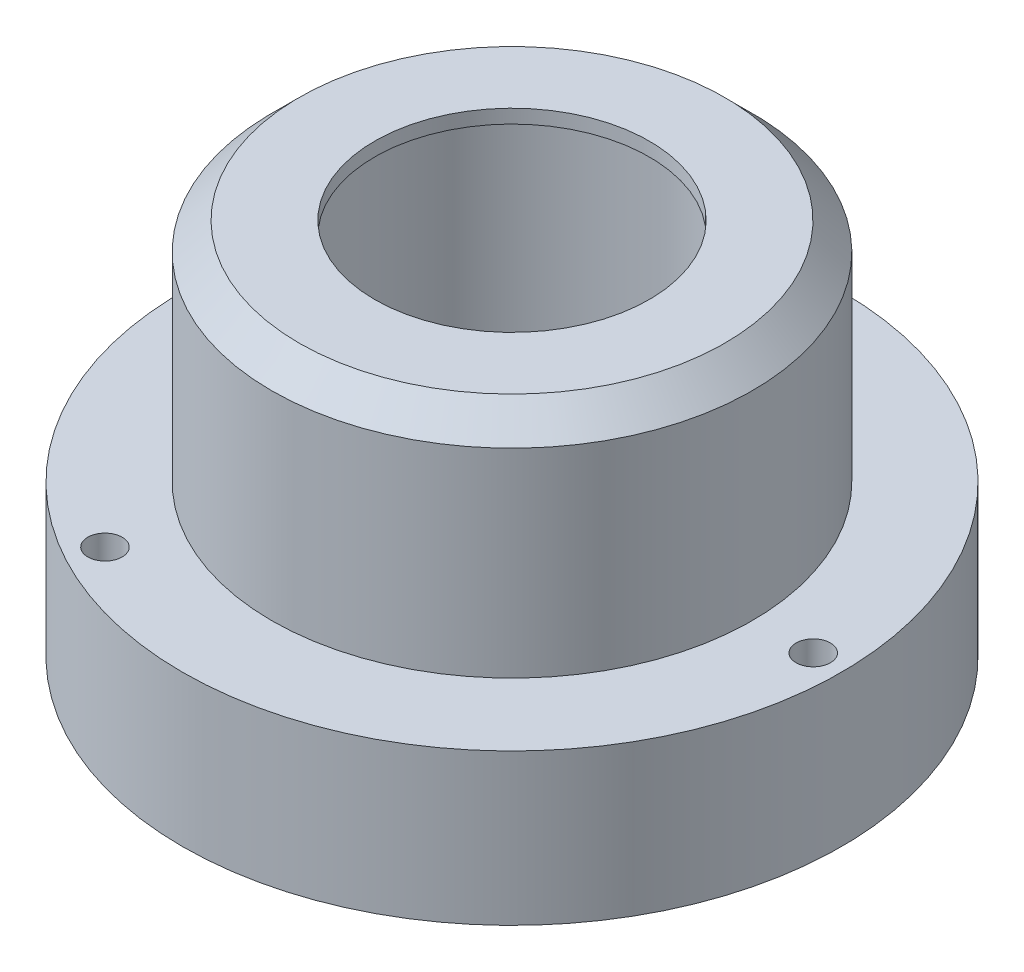
ISO-10303-21;
HEADER;
FILE_DESCRIPTION(('STEP AP214'),'2;1');
FILE_NAME('part.step','',(''),(''),'','','');
FILE_SCHEMA(('AUTOMOTIVE_DESIGN { 1 0 10303 214 1 1 1 1 }'));
ENDSEC;
DATA;
#1=APPLICATION_CONTEXT('core data for automotive mechanical design processes');
#2=APPLICATION_PROTOCOL_DEFINITION('international standard','automotive_design',2000,#1);
#3=PRODUCT_CONTEXT('',#1,'mechanical');
#4=PRODUCT('Part','Part','',(#3));
#5=PRODUCT_RELATED_PRODUCT_CATEGORY('part','',(#4));
#6=PRODUCT_DEFINITION_FORMATION('','',#4);
#7=PRODUCT_DEFINITION_CONTEXT('part definition',#1,'design');
#8=PRODUCT_DEFINITION('design','',#6,#7);
#9=PRODUCT_DEFINITION_SHAPE('','',#8);
#10=(LENGTH_UNIT() NAMED_UNIT(*) SI_UNIT(.MILLI.,.METRE.));
#11=(NAMED_UNIT(*) PLANE_ANGLE_UNIT() SI_UNIT($,.RADIAN.));
#12=(NAMED_UNIT(*) SI_UNIT($,.STERADIAN.) SOLID_ANGLE_UNIT());
#13=UNCERTAINTY_MEASURE_WITH_UNIT(LENGTH_MEASURE(1.E-05),#10,'distance_accuracy_value','');
#14=(GEOMETRIC_REPRESENTATION_CONTEXT(3) GLOBAL_UNCERTAINTY_ASSIGNED_CONTEXT((#13)) GLOBAL_UNIT_ASSIGNED_CONTEXT((#10,
#11,#12)) REPRESENTATION_CONTEXT('',''));
#15=CARTESIAN_POINT('',(0.,0.,0.));
#16=DIRECTION('',(0.,0.,1.));
#17=DIRECTION('',(1.,0.,0.));
#18=AXIS2_PLACEMENT_3D('',#15,#16,#17);
#19=CARTESIAN_POINT('',(48.,0.,0.));
#20=DIRECTION('',(0.,1.,0.));
#21=DIRECTION('',(0.,0.,1.));
#22=AXIS2_PLACEMENT_3D('',#19,#20,#21);
#23=PLANE('',#22);
#24=CARTESIAN_POINT('',(21.4999999999997,0.,37.2390923627311));
#25=DIRECTION('',(0.,-1.,0.));
#26=DIRECTION('',(0.,0.,-1.));
#27=AXIS2_PLACEMENT_3D('',#24,#25,#26);
#28=CIRCLE('',#27,2.5);
#29=CARTESIAN_POINT('',(21.4999999999997,0.,34.739092362731));
#30=VERTEX_POINT('',#29);
#31=EDGE_CURVE('E82',#30,#30,#28,.T.);
#32=ORIENTED_EDGE('',*,*,#31,.F.);
#33=EDGE_LOOP('',(#32));
#34=FACE_BOUND('',#33,.T.);
#35=CARTESIAN_POINT('',(21.5000000000002,0.,-37.2390923627308));
#36=DIRECTION('',(0.,-1.,0.));
#37=DIRECTION('',(0.,0.,-1.));
#38=AXIS2_PLACEMENT_3D('',#35,#36,#37);
#39=CIRCLE('',#38,2.5);
#40=CARTESIAN_POINT('',(21.5000000000002,0.,-39.7390923627308));
#41=VERTEX_POINT('',#40);
#42=EDGE_CURVE('E90',#41,#41,#39,.T.);
#43=ORIENTED_EDGE('',*,*,#42,.F.);
#44=EDGE_LOOP('',(#43));
#45=FACE_BOUND('',#44,.T.);
#46=CARTESIAN_POINT('',(-13.9999999999998,0.,-24.2487113059644));
#47=DIRECTION('',(0.,-1.,0.));
#48=DIRECTION('',(0.,0.,-1.));
#49=AXIS2_PLACEMENT_3D('',#46,#47,#48);
#50=CIRCLE('',#49,1.65);
#51=CARTESIAN_POINT('',(-13.9999999999998,0.,-25.8987113059644));
#52=VERTEX_POINT('',#51);
#53=EDGE_CURVE('E96',#52,#52,#50,.T.);
#54=ORIENTED_EDGE('',*,*,#53,.F.);
#55=EDGE_LOOP('',(#54));
#56=FACE_BOUND('',#55,.T.);
#57=CARTESIAN_POINT('',(-14.0000000000001,0.,24.2487113059642));
#58=DIRECTION('',(0.,-1.,0.));
#59=DIRECTION('',(0.,0.,-1.));
#60=AXIS2_PLACEMENT_3D('',#57,#58,#59);
#61=CIRCLE('',#60,1.65);
#62=CARTESIAN_POINT('',(-14.0000000000001,0.,22.5987113059642));
#63=VERTEX_POINT('',#62);
#64=EDGE_CURVE('E102',#63,#63,#61,.T.);
#65=ORIENTED_EDGE('',*,*,#64,.F.);
#66=EDGE_LOOP('',(#65));
#67=FACE_BOUND('',#66,.T.);
#68=CARTESIAN_POINT('',(-43.,0.,0.));
#69=DIRECTION('',(0.,-1.,0.));
#70=DIRECTION('',(0.,0.,-1.));
#71=AXIS2_PLACEMENT_3D('',#68,#69,#70);
#72=CIRCLE('',#71,2.5);
#73=CARTESIAN_POINT('',(-43.,0.,-2.5));
#74=VERTEX_POINT('',#73);
#75=EDGE_CURVE('E120',#74,#74,#72,.T.);
#76=ORIENTED_EDGE('',*,*,#75,.F.);
#77=EDGE_LOOP('',(#76));
#78=FACE_BOUND('',#77,.T.);
#79=CARTESIAN_POINT('',(28.,0.,0.));
#80=DIRECTION('',(0.,-1.,0.));
#81=DIRECTION('',(0.,0.,-1.));
#82=AXIS2_PLACEMENT_3D('',#79,#80,#81);
#83=CIRCLE('',#82,1.65);
#84=CARTESIAN_POINT('',(28.,0.,-1.65));
#85=VERTEX_POINT('',#84);
#86=EDGE_CURVE('E126',#85,#85,#83,.T.);
#87=ORIENTED_EDGE('',*,*,#86,.F.);
#88=EDGE_LOOP('',(#87));
#89=FACE_BOUND('',#88,.T.);
#90=CARTESIAN_POINT('',(0.,0.,0.));
#91=DIRECTION('',(0.,1.,0.));
#92=DIRECTION('',(0.,0.,1.));
#93=AXIS2_PLACEMENT_3D('',#90,#91,#92);
#94=CIRCLE('',#93,48.);
#95=CARTESIAN_POINT('',(0.,0.,48.));
#96=VERTEX_POINT('',#95);
#97=EDGE_CURVE('E135',#96,#96,#94,.T.);
#98=ORIENTED_EDGE('',*,*,#97,.F.);
#99=EDGE_LOOP('',(#98));
#100=FACE_BOUND('',#99,.T.);
#101=CARTESIAN_POINT('',(0.,0.,0.));
#102=DIRECTION('',(0.,1.,0.));
#103=DIRECTION('',(0.,0.,1.));
#104=AXIS2_PLACEMENT_3D('',#101,#102,#103);
#105=CIRCLE('',#104,23.5);
#106=CARTESIAN_POINT('',(0.,0.,23.5));
#107=VERTEX_POINT('',#106);
#108=EDGE_CURVE('E11',#107,#107,#105,.T.);
#109=ORIENTED_EDGE('',*,*,#108,.T.);
#110=EDGE_LOOP('',(#109));
#111=FACE_BOUND('',#110,.T.);
#112=ADVANCED_FACE('F38',(#34,#45,#56,#67,#78,#89,#100,#111),#23,.F.);
#113=CARTESIAN_POINT('',(0.,45.2474448154331,0.));
#114=DIRECTION('',(0.,1.,0.));
#115=DIRECTION('',(0.,0.,1.));
#116=AXIS2_PLACEMENT_3D('',#113,#114,#115);
#117=CYLINDRICAL_SURFACE('',#116,23.5);
#118=ORIENTED_EDGE('',*,*,#108,.F.);
#119=EDGE_LOOP('',(#118));
#120=FACE_BOUND('',#119,.T.);
#121=CARTESIAN_POINT('',(0.,53.,0.));
#122=DIRECTION('',(0.,1.,0.));
#123=DIRECTION('',(0.,0.,1.));
#124=AXIS2_PLACEMENT_3D('',#121,#122,#123);
#125=CIRCLE('',#124,23.5);
#126=CARTESIAN_POINT('',(0.,53.,23.5));
#127=VERTEX_POINT('',#126);
#128=EDGE_CURVE('E45',#127,#127,#125,.T.);
#129=ORIENTED_EDGE('',*,*,#128,.T.);
#130=EDGE_LOOP('',(#129));
#131=FACE_BOUND('',#130,.T.);
#132=ADVANCED_FACE('F158',(#120,#131),#117,.F.);
#133=CARTESIAN_POINT('',(23.5,53.,0.));
#134=DIRECTION('',(0.,1.,0.));
#135=DIRECTION('',(0.,0.,1.));
#136=AXIS2_PLACEMENT_3D('',#133,#134,#135);
#137=PLANE('',#136);
#138=ORIENTED_EDGE('',*,*,#128,.F.);
#139=EDGE_LOOP('',(#138));
#140=FACE_BOUND('',#139,.T.);
#141=CARTESIAN_POINT('',(0.,53.,0.));
#142=DIRECTION('',(0.,1.,0.));
#143=DIRECTION('',(0.,0.,1.));
#144=AXIS2_PLACEMENT_3D('',#141,#142,#143);
#145=CIRCLE('',#144,20.);
#146=CARTESIAN_POINT('',(0.,53.,20.));
#147=VERTEX_POINT('',#146);
#148=EDGE_CURVE('E153',#147,#147,#145,.T.);
#149=ORIENTED_EDGE('',*,*,#148,.T.);
#150=EDGE_LOOP('',(#149));
#151=FACE_BOUND('',#150,.T.);
#152=ADVANCED_FACE('F160',(#140,#151),#137,.F.);
#153=CARTESIAN_POINT('',(0.,45.2474448154331,0.));
#154=DIRECTION('',(0.,1.,0.));
#155=DIRECTION('',(0.,0.,1.));
#156=AXIS2_PLACEMENT_3D('',#153,#154,#155);
#157=CYLINDRICAL_SURFACE('',#156,20.);
#158=ORIENTED_EDGE('',*,*,#148,.F.);
#159=EDGE_LOOP('',(#158));
#160=FACE_BOUND('',#159,.T.);
#161=CARTESIAN_POINT('',(0.,55.,0.));
#162=DIRECTION('',(0.,1.,0.));
#163=DIRECTION('',(0.,0.,1.));
#164=AXIS2_PLACEMENT_3D('',#161,#162,#163);
#165=CIRCLE('',#164,20.);
#166=CARTESIAN_POINT('',(0.,55.,20.));
#167=VERTEX_POINT('',#166);
#168=EDGE_CURVE('E150',#167,#167,#165,.T.);
#169=ORIENTED_EDGE('',*,*,#168,.T.);
#170=EDGE_LOOP('',(#169));
#171=FACE_BOUND('',#170,.T.);
#172=ADVANCED_FACE('F163',(#160,#171),#157,.F.);
#173=CARTESIAN_POINT('',(20.,55.,0.));
#174=DIRECTION('',(0.,-1.,0.));
#175=DIRECTION('',(0.,0.,-1.));
#176=AXIS2_PLACEMENT_3D('',#173,#174,#175);
#177=PLANE('',#176);
#178=ORIENTED_EDGE('',*,*,#168,.F.);
#179=EDGE_LOOP('',(#178));
#180=FACE_BOUND('',#179,.T.);
#181=CARTESIAN_POINT('',(0.,55.,0.));
#182=DIRECTION('',(0.,1.,0.));
#183=DIRECTION('',(0.,0.,1.));
#184=AXIS2_PLACEMENT_3D('',#181,#182,#183);
#185=CIRCLE('',#184,31.);
#186=CARTESIAN_POINT('',(0.,55.,31.));
#187=VERTEX_POINT('',#186);
#188=EDGE_CURVE('E147',#187,#187,#185,.T.);
#189=ORIENTED_EDGE('',*,*,#188,.T.);
#190=EDGE_LOOP('',(#189));
#191=FACE_BOUND('',#190,.T.);
#192=ADVANCED_FACE('F169',(#180,#191),#177,.F.);
#193=CARTESIAN_POINT('',(0.,51.,0.));
#194=DIRECTION('',(0.,-1.,0.));
#195=DIRECTION('',(0.,0.,-1.));
#196=AXIS2_PLACEMENT_3D('',#193,#194,#195);
#197=CONICAL_SURFACE('',#196,35.,0.785398163397441);
#198=ORIENTED_EDGE('',*,*,#188,.F.);
#199=EDGE_LOOP('',(#198));
#200=FACE_BOUND('',#199,.T.);
#201=CARTESIAN_POINT('',(0.,51.,0.));
#202=DIRECTION('',(0.,1.,0.));
#203=DIRECTION('',(0.,0.,1.));
#204=AXIS2_PLACEMENT_3D('',#201,#202,#203);
#205=CIRCLE('',#204,35.);
#206=CARTESIAN_POINT('',(0.,51.,35.));
#207=VERTEX_POINT('',#206);
#208=EDGE_CURVE('E144',#207,#207,#205,.T.);
#209=ORIENTED_EDGE('',*,*,#208,.T.);
#210=EDGE_LOOP('',(#209));
#211=FACE_BOUND('',#210,.T.);
#212=ADVANCED_FACE('F175',(#200,#211),#197,.T.);
#213=CARTESIAN_POINT('',(0.,45.2474448154331,0.));
#214=DIRECTION('',(0.,1.,0.));
#215=DIRECTION('',(0.,0.,1.));
#216=AXIS2_PLACEMENT_3D('',#213,#214,#215);
#217=CYLINDRICAL_SURFACE('',#216,35.);
#218=ORIENTED_EDGE('',*,*,#208,.F.);
#219=EDGE_LOOP('',(#218));
#220=FACE_BOUND('',#219,.T.);
#221=CARTESIAN_POINT('',(0.,22.,0.));
#222=DIRECTION('',(0.,1.,0.));
#223=DIRECTION('',(0.,0.,1.));
#224=AXIS2_PLACEMENT_3D('',#221,#222,#223);
#225=CIRCLE('',#224,35.);
#226=CARTESIAN_POINT('',(0.,22.,35.));
#227=VERTEX_POINT('',#226);
#228=EDGE_CURVE('E141',#227,#227,#225,.T.);
#229=ORIENTED_EDGE('',*,*,#228,.T.);
#230=EDGE_LOOP('',(#229));
#231=FACE_BOUND('',#230,.T.);
#232=ADVANCED_FACE('F181',(#220,#231),#217,.T.);
#233=CARTESIAN_POINT('',(35.,22.,0.));
#234=DIRECTION('',(0.,-1.,0.));
#235=DIRECTION('',(0.,0.,-1.));
#236=AXIS2_PLACEMENT_3D('',#233,#234,#235);
#237=PLANE('',#236);
#238=CARTESIAN_POINT('',(-22.0764460655011,22.,-37.4817359405487));
#239=DIRECTION('',(0.,1.,0.));
#240=DIRECTION('',(0.,0.,1.));
#241=AXIS2_PLACEMENT_3D('',#238,#239,#240);
#242=CIRCLE('',#241,2.5);
#243=CARTESIAN_POINT('',(-22.0764460655011,22.,-34.9817359405487));
#244=VERTEX_POINT('',#243);
#245=EDGE_CURVE('E108',#244,#244,#242,.T.);
#246=ORIENTED_EDGE('',*,*,#245,.F.);
#247=EDGE_LOOP('',(#246));
#248=FACE_BOUND('',#247,.T.);
#249=CARTESIAN_POINT('',(-21.4219124697047,22.,37.8596310882754));
#250=DIRECTION('',(0.,1.,0.));
#251=DIRECTION('',(0.,0.,1.));
#252=AXIS2_PLACEMENT_3D('',#249,#250,#251);
#253=CIRCLE('',#252,2.5);
#254=CARTESIAN_POINT('',(-21.4219124697047,22.,40.3596310882754));
#255=VERTEX_POINT('',#254);
#256=EDGE_CURVE('E114',#255,#255,#253,.T.);
#257=ORIENTED_EDGE('',*,*,#256,.F.);
#258=EDGE_LOOP('',(#257));
#259=FACE_BOUND('',#258,.T.);
#260=CARTESIAN_POINT('',(43.498358535206,22.,-0.377895147727013));
#261=DIRECTION('',(0.,1.,0.));
#262=DIRECTION('',(0.,0.,1.));
#263=AXIS2_PLACEMENT_3D('',#260,#261,#262);
#264=CIRCLE('',#263,2.5);
#265=CARTESIAN_POINT('',(43.498358535206,22.,2.12210485227299));
#266=VERTEX_POINT('',#265);
#267=EDGE_CURVE('E132',#266,#266,#264,.T.);
#268=ORIENTED_EDGE('',*,*,#267,.F.);
#269=EDGE_LOOP('',(#268));
#270=FACE_BOUND('',#269,.T.);
#271=ORIENTED_EDGE('',*,*,#228,.F.);
#272=EDGE_LOOP('',(#271));
#273=FACE_BOUND('',#272,.T.);
#274=CARTESIAN_POINT('',(0.,22.,0.));
#275=DIRECTION('',(0.,1.,0.));
#276=DIRECTION('',(0.,0.,1.));
#277=AXIS2_PLACEMENT_3D('',#274,#275,#276);
#278=CIRCLE('',#277,48.);
#279=CARTESIAN_POINT('',(0.,22.,48.));
#280=VERTEX_POINT('',#279);
#281=EDGE_CURVE('E138',#280,#280,#278,.T.);
#282=ORIENTED_EDGE('',*,*,#281,.T.);
#283=EDGE_LOOP('',(#282));
#284=FACE_BOUND('',#283,.T.);
#285=ADVANCED_FACE('F187',(#248,#259,#270,#273,#284),#237,.F.);
#286=CARTESIAN_POINT('',(0.,45.2474448154331,0.));
#287=DIRECTION('',(0.,1.,0.));
#288=DIRECTION('',(0.,0.,1.));
#289=AXIS2_PLACEMENT_3D('',#286,#287,#288);
#290=CYLINDRICAL_SURFACE('',#289,48.);
#291=ORIENTED_EDGE('',*,*,#281,.F.);
#292=EDGE_LOOP('',(#291));
#293=FACE_BOUND('',#292,.T.);
#294=ORIENTED_EDGE('',*,*,#97,.T.);
#295=EDGE_LOOP('',(#294));
#296=FACE_BOUND('',#295,.T.);
#297=ADVANCED_FACE('F193',(#293,#296),#290,.T.);
#298=CARTESIAN_POINT('',(43.498358535206,22.,-0.377895147727013));
#299=DIRECTION('',(0.,1.,0.));
#300=DIRECTION('',(0.,0.,1.));
#301=AXIS2_PLACEMENT_3D('',#298,#299,#300);
#302=CYLINDRICAL_SURFACE('',#301,2.5);
#303=CARTESIAN_POINT('',(43.498358535206,5.,-0.377895147727013));
#304=DIRECTION('',(0.,1.,0.));
#305=DIRECTION('',(0.,0.,1.));
#306=AXIS2_PLACEMENT_3D('',#303,#304,#305);
#307=CIRCLE('',#306,2.5);
#308=CARTESIAN_POINT('',(43.498358535206,5.,2.12210485227298));
#309=VERTEX_POINT('',#308);
#310=EDGE_CURVE('E129',#309,#309,#307,.T.);
#311=ORIENTED_EDGE('',*,*,#310,.F.);
#312=EDGE_LOOP('',(#311));
#313=FACE_BOUND('',#312,.T.);
#314=ORIENTED_EDGE('',*,*,#267,.T.);
#315=EDGE_LOOP('',(#314));
#316=FACE_BOUND('',#315,.T.);
#317=ADVANCED_FACE('F200',(#313,#316),#302,.F.);
#318=CARTESIAN_POINT('',(43.498358535206,5.,-0.377895147727013));
#319=DIRECTION('',(0.,1.,0.));
#320=DIRECTION('',(0.,0.,1.));
#321=AXIS2_PLACEMENT_3D('',#318,#319,#320);
#322=CONICAL_SURFACE('',#321,2.5,1.04719755119659);
#323=CARTESIAN_POINT('',(43.498358535206,3.55662432702593,-0.377895147727013));
#324=VERTEX_POINT('',#323);
#325=VERTEX_LOOP('',#324);
#326=FACE_BOUND('',#325,.T.);
#327=ORIENTED_EDGE('',*,*,#310,.T.);
#328=EDGE_LOOP('',(#327));
#329=FACE_BOUND('',#328,.T.);
#330=ADVANCED_FACE('F215',(#326,#329),#322,.F.);
#331=CARTESIAN_POINT('',(28.,0.,0.));
#332=DIRECTION('',(0.,-1.,0.));
#333=DIRECTION('',(0.,0.,-1.));
#334=AXIS2_PLACEMENT_3D('',#331,#332,#333);
#335=CYLINDRICAL_SURFACE('',#334,1.65);
#336=CARTESIAN_POINT('',(28.,11.5,0.));
#337=DIRECTION('',(0.,-1.,0.));
#338=DIRECTION('',(0.,0.,-1.));
#339=AXIS2_PLACEMENT_3D('',#336,#337,#338);
#340=CIRCLE('',#339,1.65);
#341=CARTESIAN_POINT('',(28.,11.5,-1.65));
#342=VERTEX_POINT('',#341);
#343=EDGE_CURVE('E123',#342,#342,#340,.T.);
#344=ORIENTED_EDGE('',*,*,#343,.F.);
#345=EDGE_LOOP('',(#344));
#346=FACE_BOUND('',#345,.T.);
#347=ORIENTED_EDGE('',*,*,#86,.T.);
#348=EDGE_LOOP('',(#347));
#349=FACE_BOUND('',#348,.T.);
#350=ADVANCED_FACE('F219',(#346,#349),#335,.F.);
#351=CARTESIAN_POINT('',(28.,11.5,0.));
#352=DIRECTION('',(0.,-1.,0.));
#353=DIRECTION('',(0.,0.,-1.));
#354=AXIS2_PLACEMENT_3D('',#351,#352,#353);
#355=CONICAL_SURFACE('',#354,1.65,1.04719755119659);
#356=CARTESIAN_POINT('',(28.,12.4526279441629,0.));
#357=VERTEX_POINT('',#356);
#358=VERTEX_LOOP('',#357);
#359=FACE_BOUND('',#358,.T.);
#360=ORIENTED_EDGE('',*,*,#343,.T.);
#361=EDGE_LOOP('',(#360));
#362=FACE_BOUND('',#361,.T.);
#363=ADVANCED_FACE('F222',(#359,#362),#355,.F.);
#364=CARTESIAN_POINT('',(-43.,0.,0.));
#365=DIRECTION('',(0.,-1.,0.));
#366=DIRECTION('',(0.,0.,-1.));
#367=AXIS2_PLACEMENT_3D('',#364,#365,#366);
#368=CYLINDRICAL_SURFACE('',#367,2.5);
#369=CARTESIAN_POINT('',(-43.,17.,0.));
#370=DIRECTION('',(0.,-1.,0.));
#371=DIRECTION('',(0.,0.,-1.));
#372=AXIS2_PLACEMENT_3D('',#369,#370,#371);
#373=CIRCLE('',#372,2.5);
#374=CARTESIAN_POINT('',(-43.,17.,-2.49999999999999));
#375=VERTEX_POINT('',#374);
#376=EDGE_CURVE('E117',#375,#375,#373,.T.);
#377=ORIENTED_EDGE('',*,*,#376,.F.);
#378=EDGE_LOOP('',(#377));
#379=FACE_BOUND('',#378,.T.);
#380=ORIENTED_EDGE('',*,*,#75,.T.);
#381=EDGE_LOOP('',(#380));
#382=FACE_BOUND('',#381,.T.);
#383=ADVANCED_FACE('F226',(#379,#382),#368,.F.);
#384=CARTESIAN_POINT('',(-43.,17.,0.));
#385=DIRECTION('',(0.,-1.,0.));
#386=DIRECTION('',(0.,0.,-1.));
#387=AXIS2_PLACEMENT_3D('',#384,#385,#386);
#388=CONICAL_SURFACE('',#387,2.5,1.0471975511966);
#389=CARTESIAN_POINT('',(-43.,18.4433756729741,0.));
#390=VERTEX_POINT('',#389);
#391=VERTEX_LOOP('',#390);
#392=FACE_BOUND('',#391,.T.);
#393=ORIENTED_EDGE('',*,*,#376,.T.);
#394=EDGE_LOOP('',(#393));
#395=FACE_BOUND('',#394,.T.);
#396=ADVANCED_FACE('F229',(#392,#395),#388,.F.);
#397=CARTESIAN_POINT('',(-21.4219124697047,22.,37.8596310882754));
#398=DIRECTION('',(0.,1.,0.));
#399=DIRECTION('',(0.,0.,1.));
#400=AXIS2_PLACEMENT_3D('',#397,#398,#399);
#401=CYLINDRICAL_SURFACE('',#400,2.5);
#402=CARTESIAN_POINT('',(-21.4219124697047,5.,37.8596310882754));
#403=DIRECTION('',(0.,1.,0.));
#404=DIRECTION('',(0.,0.,1.));
#405=AXIS2_PLACEMENT_3D('',#402,#403,#404);
#406=CIRCLE('',#405,2.5);
#407=CARTESIAN_POINT('',(-21.4219124697047,5.,40.3596310882754));
#408=VERTEX_POINT('',#407);
#409=EDGE_CURVE('E111',#408,#408,#406,.T.);
#410=ORIENTED_EDGE('',*,*,#409,.F.);
#411=EDGE_LOOP('',(#410));
#412=FACE_BOUND('',#411,.T.);
#413=ORIENTED_EDGE('',*,*,#256,.T.);
#414=EDGE_LOOP('',(#413));
#415=FACE_BOUND('',#414,.T.);
#416=ADVANCED_FACE('F233',(#412,#415),#401,.F.);
#417=CARTESIAN_POINT('',(-21.4219124697047,5.,37.8596310882754));
#418=DIRECTION('',(0.,1.,0.));
#419=DIRECTION('',(0.,0.,1.));
#420=AXIS2_PLACEMENT_3D('',#417,#418,#419);
#421=CONICAL_SURFACE('',#420,2.5,1.04719755119659);
#422=CARTESIAN_POINT('',(-21.4219124697047,3.55662432702593,37.8596310882754));
#423=VERTEX_POINT('',#422);
#424=VERTEX_LOOP('',#423);
#425=FACE_BOUND('',#424,.T.);
#426=ORIENTED_EDGE('',*,*,#409,.T.);
#427=EDGE_LOOP('',(#426));
#428=FACE_BOUND('',#427,.T.);
#429=ADVANCED_FACE('F237',(#425,#428),#421,.F.);
#430=CARTESIAN_POINT('',(-22.0764460655011,22.,-37.4817359405487));
#431=DIRECTION('',(0.,1.,0.));
#432=DIRECTION('',(0.,0.,1.));
#433=AXIS2_PLACEMENT_3D('',#430,#431,#432);
#434=CYLINDRICAL_SURFACE('',#433,2.5);
#435=CARTESIAN_POINT('',(-22.0764460655011,5.,-37.4817359405487));
#436=DIRECTION('',(0.,1.,0.));
#437=DIRECTION('',(0.,0.,1.));
#438=AXIS2_PLACEMENT_3D('',#435,#436,#437);
#439=CIRCLE('',#438,2.5);
#440=CARTESIAN_POINT('',(-22.0764460655011,5.,-34.9817359405487));
#441=VERTEX_POINT('',#440);
#442=EDGE_CURVE('E105',#441,#441,#439,.T.);
#443=ORIENTED_EDGE('',*,*,#442,.F.);
#444=EDGE_LOOP('',(#443));
#445=FACE_BOUND('',#444,.T.);
#446=ORIENTED_EDGE('',*,*,#245,.T.);
#447=EDGE_LOOP('',(#446));
#448=FACE_BOUND('',#447,.T.);
#449=ADVANCED_FACE('F241',(#445,#448),#434,.F.);
#450=CARTESIAN_POINT('',(-22.0764460655011,5.,-37.4817359405487));
#451=DIRECTION('',(0.,1.,0.));
#452=DIRECTION('',(0.,0.,1.));
#453=AXIS2_PLACEMENT_3D('',#450,#451,#452);
#454=CONICAL_SURFACE('',#453,2.5,1.04719755119659);
#455=CARTESIAN_POINT('',(-22.0764460655011,3.55662432702593,-37.4817359405487));
#456=VERTEX_POINT('',#455);
#457=VERTEX_LOOP('',#456);
#458=FACE_BOUND('',#457,.T.);
#459=ORIENTED_EDGE('',*,*,#442,.T.);
#460=EDGE_LOOP('',(#459));
#461=FACE_BOUND('',#460,.T.);
#462=ADVANCED_FACE('F245',(#458,#461),#454,.F.);
#463=CARTESIAN_POINT('',(-14.0000000000001,0.,24.2487113059642));
#464=DIRECTION('',(0.,-1.,0.));
#465=DIRECTION('',(0.,0.,-1.));
#466=AXIS2_PLACEMENT_3D('',#463,#464,#465);
#467=CYLINDRICAL_SURFACE('',#466,1.65);
#468=CARTESIAN_POINT('',(-14.0000000000001,11.5,24.2487113059642));
#469=DIRECTION('',(0.,-1.,0.));
#470=DIRECTION('',(0.,0.,-1.));
#471=AXIS2_PLACEMENT_3D('',#468,#469,#470);
#472=CIRCLE('',#471,1.65);
#473=CARTESIAN_POINT('',(-14.0000000000001,11.5,22.5987113059642));
#474=VERTEX_POINT('',#473);
#475=EDGE_CURVE('E99',#474,#474,#472,.T.);
#476=ORIENTED_EDGE('',*,*,#475,.F.);
#477=EDGE_LOOP('',(#476));
#478=FACE_BOUND('',#477,.T.);
#479=ORIENTED_EDGE('',*,*,#64,.T.);
#480=EDGE_LOOP('',(#479));
#481=FACE_BOUND('',#480,.T.);
#482=ADVANCED_FACE('F249',(#478,#481),#467,.F.);
#483=CARTESIAN_POINT('',(-14.0000000000001,11.5,24.2487113059642));
#484=DIRECTION('',(0.,-1.,0.));
#485=DIRECTION('',(0.,0.,-1.));
#486=AXIS2_PLACEMENT_3D('',#483,#484,#485);
#487=CONICAL_SURFACE('',#486,1.65,1.0471975511966);
#488=CARTESIAN_POINT('',(-14.0000000000001,12.4526279441629,24.2487113059642));
#489=VERTEX_POINT('',#488);
#490=VERTEX_LOOP('',#489);
#491=FACE_BOUND('',#490,.T.);
#492=ORIENTED_EDGE('',*,*,#475,.T.);
#493=EDGE_LOOP('',(#492));
#494=FACE_BOUND('',#493,.T.);
#495=ADVANCED_FACE('F253',(#491,#494),#487,.F.);
#496=CARTESIAN_POINT('',(-13.9999999999998,0.,-24.2487113059644));
#497=DIRECTION('',(0.,-1.,0.));
#498=DIRECTION('',(0.,0.,-1.));
#499=AXIS2_PLACEMENT_3D('',#496,#497,#498);
#500=CYLINDRICAL_SURFACE('',#499,1.65);
#501=CARTESIAN_POINT('',(-13.9999999999998,11.5,-24.2487113059644));
#502=DIRECTION('',(0.,-1.,0.));
#503=DIRECTION('',(0.,0.,-1.));
#504=AXIS2_PLACEMENT_3D('',#501,#502,#503);
#505=CIRCLE('',#504,1.65);
#506=CARTESIAN_POINT('',(-13.9999999999998,11.5,-25.8987113059644));
#507=VERTEX_POINT('',#506);
#508=EDGE_CURVE('E93',#507,#507,#505,.T.);
#509=ORIENTED_EDGE('',*,*,#508,.F.);
#510=EDGE_LOOP('',(#509));
#511=FACE_BOUND('',#510,.T.);
#512=ORIENTED_EDGE('',*,*,#53,.T.);
#513=EDGE_LOOP('',(#512));
#514=FACE_BOUND('',#513,.T.);
#515=ADVANCED_FACE('F257',(#511,#514),#500,.F.);
#516=CARTESIAN_POINT('',(-13.9999999999998,11.5,-24.2487113059644));
#517=DIRECTION('',(0.,-1.,0.));
#518=DIRECTION('',(0.,0.,-1.));
#519=AXIS2_PLACEMENT_3D('',#516,#517,#518);
#520=CONICAL_SURFACE('',#519,1.65,1.0471975511966);
#521=CARTESIAN_POINT('',(-13.9999999999998,12.4526279441629,-24.2487113059644));
#522=VERTEX_POINT('',#521);
#523=VERTEX_LOOP('',#522);
#524=FACE_BOUND('',#523,.T.);
#525=ORIENTED_EDGE('',*,*,#508,.T.);
#526=EDGE_LOOP('',(#525));
#527=FACE_BOUND('',#526,.T.);
#528=ADVANCED_FACE('F261',(#524,#527),#520,.F.);
#529=CARTESIAN_POINT('',(21.5000000000002,0.,-37.2390923627308));
#530=DIRECTION('',(0.,-1.,0.));
#531=DIRECTION('',(0.,0.,-1.));
#532=AXIS2_PLACEMENT_3D('',#529,#530,#531);
#533=CYLINDRICAL_SURFACE('',#532,2.5);
#534=CARTESIAN_POINT('',(21.5000000000002,17.,-37.2390923627308));
#535=DIRECTION('',(0.,-1.,0.));
#536=DIRECTION('',(0.,0.,-1.));
#537=AXIS2_PLACEMENT_3D('',#534,#535,#536);
#538=CIRCLE('',#537,2.5);
#539=CARTESIAN_POINT('',(21.5000000000002,17.,-39.7390923627308));
#540=VERTEX_POINT('',#539);
#541=EDGE_CURVE('E85',#540,#540,#538,.T.);
#542=ORIENTED_EDGE('',*,*,#541,.F.);
#543=EDGE_LOOP('',(#542));
#544=FACE_BOUND('',#543,.T.);
#545=ORIENTED_EDGE('',*,*,#42,.T.);
#546=EDGE_LOOP('',(#545));
#547=FACE_BOUND('',#546,.T.);
#548=ADVANCED_FACE('F265',(#544,#547),#533,.F.);
#549=CARTESIAN_POINT('',(21.5000000000002,17.,-37.2390923627308));
#550=DIRECTION('',(0.,-1.,0.));
#551=DIRECTION('',(0.,0.,-1.));
#552=AXIS2_PLACEMENT_3D('',#549,#550,#551);
#553=CONICAL_SURFACE('',#552,2.5,1.0471975511966);
#554=CARTESIAN_POINT('',(21.5000000000002,18.4433756729741,-37.2390923627308));
#555=VERTEX_POINT('',#554);
#556=VERTEX_LOOP('',#555);
#557=FACE_BOUND('',#556,.T.);
#558=ORIENTED_EDGE('',*,*,#541,.T.);
#559=EDGE_LOOP('',(#558));
#560=FACE_BOUND('',#559,.T.);
#561=ADVANCED_FACE('F269',(#557,#560),#553,.F.);
#562=CARTESIAN_POINT('',(21.4999999999997,0.,37.2390923627311));
#563=DIRECTION('',(0.,-1.,0.));
#564=DIRECTION('',(0.,0.,-1.));
#565=AXIS2_PLACEMENT_3D('',#562,#563,#564);
#566=CYLINDRICAL_SURFACE('',#565,2.5);
#567=CARTESIAN_POINT('',(21.4999999999997,17.,37.2390923627311));
#568=DIRECTION('',(0.,-1.,0.));
#569=DIRECTION('',(0.,0.,-1.));
#570=AXIS2_PLACEMENT_3D('',#567,#568,#569);
#571=CIRCLE('',#570,2.5);
#572=CARTESIAN_POINT('',(21.4999999999997,17.,34.7390923627311));
#573=VERTEX_POINT('',#572);
#574=EDGE_CURVE('E80',#573,#573,#571,.T.);
#575=ORIENTED_EDGE('',*,*,#574,.F.);
#576=EDGE_LOOP('',(#575));
#577=FACE_BOUND('',#576,.T.);
#578=ORIENTED_EDGE('',*,*,#31,.T.);
#579=EDGE_LOOP('',(#578));
#580=FACE_BOUND('',#579,.T.);
#581=ADVANCED_FACE('F76',(#577,#580),#566,.F.);
#582=CARTESIAN_POINT('',(21.4999999999997,17.,37.2390923627311));
#583=DIRECTION('',(0.,-1.,0.));
#584=DIRECTION('',(0.,0.,-1.));
#585=AXIS2_PLACEMENT_3D('',#582,#583,#584);
#586=CONICAL_SURFACE('',#585,2.5,1.0471975511966);
#587=CARTESIAN_POINT('',(21.4999999999997,18.4433756729741,37.2390923627311));
#588=VERTEX_POINT('',#587);
#589=VERTEX_LOOP('',#588);
#590=FACE_BOUND('',#589,.T.);
#591=ORIENTED_EDGE('',*,*,#574,.T.);
#592=EDGE_LOOP('',(#591));
#593=FACE_BOUND('',#592,.T.);
#594=ADVANCED_FACE('F73',(#590,#593),#586,.F.);
#595=CLOSED_SHELL('',(#112,#132,#152,#172,#192,#212,#232,#285,#297,#317,#330,#350,#363,#383,
#396,#416,#429,#449,#462,#482,#495,#515,#528,#548,#561,#581,#594));
#596=MANIFOLD_SOLID_BREP('B2',#595);
#597=ADVANCED_BREP_SHAPE_REPRESENTATION('',(#18,#596),#14);
#598=SHAPE_DEFINITION_REPRESENTATION(#9,#597);
ENDSEC;
END-ISO-10303-21;
